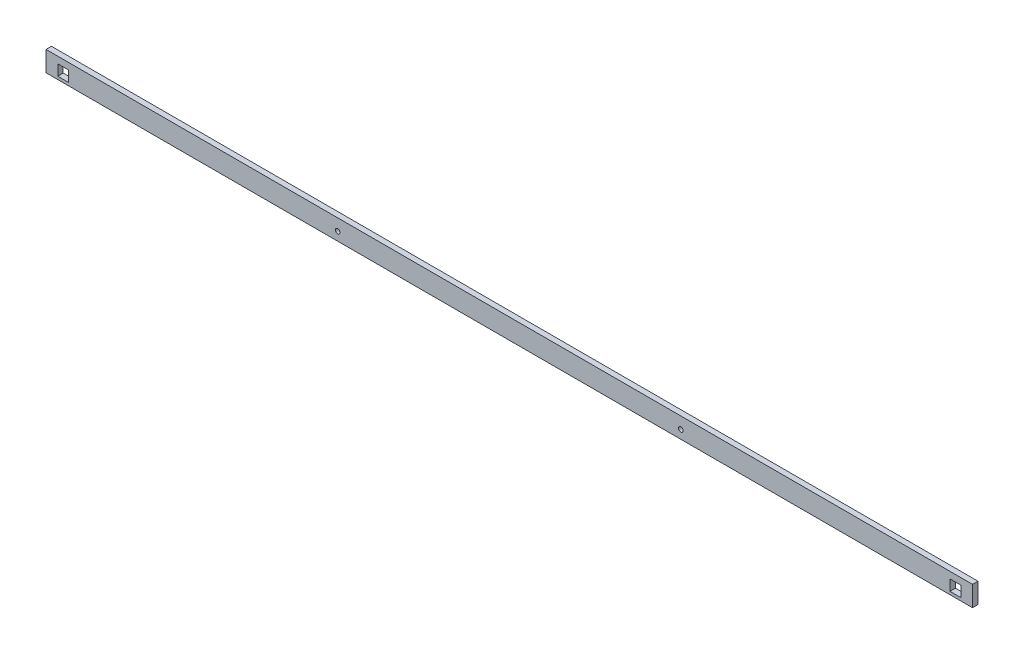
ISO-10303-21;
HEADER;
FILE_DESCRIPTION(('STEP AP214'),'2;1');
FILE_NAME('part.step','',(''),(''),'','','');
FILE_SCHEMA(('AUTOMOTIVE_DESIGN { 1 0 10303 214 1 1 1 1 }'));
ENDSEC;
DATA;
#1=APPLICATION_CONTEXT('core data for automotive mechanical design processes');
#2=APPLICATION_PROTOCOL_DEFINITION('international standard','automotive_design',2000,#1);
#3=PRODUCT_CONTEXT('',#1,'mechanical');
#4=PRODUCT('Part','Part','',(#3));
#5=PRODUCT_RELATED_PRODUCT_CATEGORY('part','',(#4));
#6=PRODUCT_DEFINITION_FORMATION('','',#4);
#7=PRODUCT_DEFINITION_CONTEXT('part definition',#1,'design');
#8=PRODUCT_DEFINITION('design','',#6,#7);
#9=PRODUCT_DEFINITION_SHAPE('','',#8);
#10=(LENGTH_UNIT() NAMED_UNIT(*) SI_UNIT(.MILLI.,.METRE.));
#11=(NAMED_UNIT(*) PLANE_ANGLE_UNIT() SI_UNIT($,.RADIAN.));
#12=(NAMED_UNIT(*) SI_UNIT($,.STERADIAN.) SOLID_ANGLE_UNIT());
#13=UNCERTAINTY_MEASURE_WITH_UNIT(LENGTH_MEASURE(1.E-05),#10,'distance_accuracy_value','');
#14=(GEOMETRIC_REPRESENTATION_CONTEXT(3) GLOBAL_UNCERTAINTY_ASSIGNED_CONTEXT((#13)) GLOBAL_UNIT_ASSIGNED_CONTEXT((#10,
#11,#12)) REPRESENTATION_CONTEXT('',''));
#15=CARTESIAN_POINT('',(0.,0.,0.));
#16=DIRECTION('',(0.,0.,1.));
#17=DIRECTION('',(1.,0.,0.));
#18=AXIS2_PLACEMENT_3D('',#15,#16,#17);
#19=CARTESIAN_POINT('',(0.,0.,3.18));
#20=DIRECTION('',(0.,0.,1.));
#21=DIRECTION('',(1.,0.,0.));
#22=AXIS2_PLACEMENT_3D('',#19,#20,#21);
#23=PLANE('',#22);
#24=CARTESIAN_POINT('',(-100.,-0.900000000000001,3.18));
#25=DIRECTION('',(0.,0.,-1.));
#26=DIRECTION('',(-1.,0.,0.));
#27=AXIS2_PLACEMENT_3D('',#24,#25,#26);
#28=CIRCLE('',#27,1.35000000000001);
#29=CARTESIAN_POINT('',(-98.65,-0.900000000000001,3.18));
#30=VERTEX_POINT('',#29);
#31=EDGE_CURVE('E345',#30,#30,#28,.T.);
#32=ORIENTED_EDGE('',*,*,#31,.T.);
#33=EDGE_LOOP('',(#32));
#34=FACE_BOUND('',#33,.T.);
#35=CARTESIAN_POINT('',(100.,-0.900000000000001,3.18));
#36=DIRECTION('',(0.,0.,1.));
#37=DIRECTION('',(1.,0.,0.));
#38=AXIS2_PLACEMENT_3D('',#35,#36,#37);
#39=CIRCLE('',#38,1.35000000000001);
#40=CARTESIAN_POINT('',(101.35,-0.900000000000001,3.18));
#41=VERTEX_POINT('',#40);
#42=EDGE_CURVE('E352',#41,#41,#39,.T.);
#43=ORIENTED_EDGE('',*,*,#42,.F.);
#44=EDGE_LOOP('',(#43));
#45=FACE_BOUND('',#44,.T.);
#46=DIRECTION('',(0.,1.,0.));
#47=VECTOR('',#46,1.);
#48=CARTESIAN_POINT('',(263.14,2.08999999999998,3.18));
#49=LINE('',#48,#47);
#50=CARTESIAN_POINT('',(263.14,-4.19000000000002,3.18));
#51=VERTEX_POINT('',#50);
#52=CARTESIAN_POINT('',(263.14,2.08999999999998,3.18));
#53=VERTEX_POINT('',#52);
#54=EDGE_CURVE('E183',#51,#53,#49,.T.);
#55=ORIENTED_EDGE('',*,*,#54,.F.);
#56=DIRECTION('',(1.,0.,0.));
#57=VECTOR('',#56,1.);
#58=CARTESIAN_POINT('',(256.86,-4.19000000000002,3.18));
#59=LINE('',#58,#57);
#60=CARTESIAN_POINT('',(256.86,-4.19000000000002,3.18));
#61=VERTEX_POINT('',#60);
#62=EDGE_CURVE('E194',#61,#51,#59,.T.);
#63=ORIENTED_EDGE('',*,*,#62,.F.);
#64=DIRECTION('',(0.,-1.,0.));
#65=VECTOR('',#64,1.);
#66=CARTESIAN_POINT('',(256.86,2.08999999999998,3.18));
#67=LINE('',#66,#65);
#68=CARTESIAN_POINT('',(256.86,2.08999999999998,3.18));
#69=VERTEX_POINT('',#68);
#70=EDGE_CURVE('E190',#69,#61,#67,.T.);
#71=ORIENTED_EDGE('',*,*,#70,.F.);
#72=DIRECTION('',(-1.,0.,0.));
#73=VECTOR('',#72,1.);
#74=CARTESIAN_POINT('',(256.86,2.08999999999998,3.18));
#75=LINE('',#74,#73);
#76=EDGE_CURVE('E186',#53,#69,#75,.T.);
#77=ORIENTED_EDGE('',*,*,#76,.F.);
#78=EDGE_LOOP('',(#55,#63,#71,#77));
#79=FACE_BOUND('',#78,.T.);
#80=DIRECTION('',(0.,1.,0.));
#81=VECTOR('',#80,1.);
#82=CARTESIAN_POINT('',(270.,5.9,3.18));
#83=LINE('',#82,#81);
#84=CARTESIAN_POINT('',(270.,-5.9,3.18));
#85=VERTEX_POINT('',#84);
#86=CARTESIAN_POINT('',(270.,5.9,3.18));
#87=VERTEX_POINT('',#86);
#88=EDGE_CURVE('E216',#85,#87,#83,.T.);
#89=ORIENTED_EDGE('',*,*,#88,.T.);
#90=DIRECTION('',(-1.,0.,0.));
#91=VECTOR('',#90,1.);
#92=CARTESIAN_POINT('',(-270.,5.9,3.18));
#93=LINE('',#92,#91);
#94=CARTESIAN_POINT('',(-270.,5.9,3.18));
#95=VERTEX_POINT('',#94);
#96=EDGE_CURVE('E220',#87,#95,#93,.T.);
#97=ORIENTED_EDGE('',*,*,#96,.T.);
#98=DIRECTION('',(0.,-1.,0.));
#99=VECTOR('',#98,1.);
#100=CARTESIAN_POINT('',(-270.,5.9,3.18));
#101=LINE('',#100,#99);
#102=CARTESIAN_POINT('',(-270.,-5.9,3.18));
#103=VERTEX_POINT('',#102);
#104=EDGE_CURVE('E224',#95,#103,#101,.T.);
#105=ORIENTED_EDGE('',*,*,#104,.T.);
#106=DIRECTION('',(1.,0.,0.));
#107=VECTOR('',#106,1.);
#108=CARTESIAN_POINT('',(-270.,-5.9,3.18));
#109=LINE('',#108,#107);
#110=EDGE_CURVE('E227',#103,#85,#109,.T.);
#111=ORIENTED_EDGE('',*,*,#110,.T.);
#112=EDGE_LOOP('',(#89,#97,#105,#111));
#113=FACE_BOUND('',#112,.T.);
#114=DIRECTION('',(-1.,0.,0.));
#115=VECTOR('',#114,1.);
#116=CARTESIAN_POINT('',(-256.86,-4.19000000000002,3.18));
#117=LINE('',#116,#115);
#118=CARTESIAN_POINT('',(-256.86,-4.19000000000002,3.18));
#119=VERTEX_POINT('',#118);
#120=CARTESIAN_POINT('',(-263.14,-4.19000000000002,3.18));
#121=VERTEX_POINT('',#120);
#122=EDGE_CURVE('E151',#119,#121,#117,.T.);
#123=ORIENTED_EDGE('',*,*,#122,.T.);
#124=DIRECTION('',(0.,1.,0.));
#125=VECTOR('',#124,1.);
#126=CARTESIAN_POINT('',(-263.14,2.08999999999998,3.18));
#127=LINE('',#126,#125);
#128=CARTESIAN_POINT('',(-263.14,2.08999999999998,3.18));
#129=VERTEX_POINT('',#128);
#130=EDGE_CURVE('E54',#121,#129,#127,.T.);
#131=ORIENTED_EDGE('',*,*,#130,.T.);
#132=DIRECTION('',(1.,0.,0.));
#133=VECTOR('',#132,1.);
#134=CARTESIAN_POINT('',(-256.86,2.08999999999998,3.18));
#135=LINE('',#134,#133);
#136=CARTESIAN_POINT('',(-256.86,2.08999999999998,3.18));
#137=VERTEX_POINT('',#136);
#138=EDGE_CURVE('E142',#129,#137,#135,.T.);
#139=ORIENTED_EDGE('',*,*,#138,.T.);
#140=DIRECTION('',(0.,-1.,0.));
#141=VECTOR('',#140,1.);
#142=CARTESIAN_POINT('',(-256.86,2.08999999999998,3.18));
#143=LINE('',#142,#141);
#144=EDGE_CURVE('E159',#137,#119,#143,.T.);
#145=ORIENTED_EDGE('',*,*,#144,.T.);
#146=EDGE_LOOP('',(#123,#131,#139,#145));
#147=FACE_BOUND('',#146,.T.);
#148=ADVANCED_FACE('F38',(#34,#45,#79,#113,#147),#23,.T.);
#149=CARTESIAN_POINT('',(0.,0.,0.));
#150=DIRECTION('',(0.,0.,1.));
#151=DIRECTION('',(1.,0.,0.));
#152=AXIS2_PLACEMENT_3D('',#149,#150,#151);
#153=PLANE('',#152);
#154=CARTESIAN_POINT('',(-100.,-0.900000000000001,0.));
#155=DIRECTION('',(0.,0.,1.));
#156=DIRECTION('',(1.,0.,0.));
#157=AXIS2_PLACEMENT_3D('',#154,#155,#156);
#158=CIRCLE('',#157,1.35000000000001);
#159=CARTESIAN_POINT('',(-98.65,-0.900000000000001,0.));
#160=VERTEX_POINT('',#159);
#161=EDGE_CURVE('E348',#160,#160,#158,.T.);
#162=ORIENTED_EDGE('',*,*,#161,.T.);
#163=EDGE_LOOP('',(#162));
#164=FACE_BOUND('',#163,.T.);
#165=CARTESIAN_POINT('',(100.,-0.900000000000001,0.));
#166=DIRECTION('',(0.,0.,1.));
#167=DIRECTION('',(1.,0.,0.));
#168=AXIS2_PLACEMENT_3D('',#165,#166,#167);
#169=CIRCLE('',#168,1.35000000000001);
#170=CARTESIAN_POINT('',(101.35,-0.900000000000001,0.));
#171=VERTEX_POINT('',#170);
#172=EDGE_CURVE('E358',#171,#171,#169,.F.);
#173=ORIENTED_EDGE('',*,*,#172,.F.);
#174=EDGE_LOOP('',(#173));
#175=FACE_BOUND('',#174,.T.);
#176=DIRECTION('',(0.,1.,0.));
#177=VECTOR('',#176,1.);
#178=CARTESIAN_POINT('',(270.,5.9,0.));
#179=LINE('',#178,#177);
#180=CARTESIAN_POINT('',(270.,-5.9,0.));
#181=VERTEX_POINT('',#180);
#182=CARTESIAN_POINT('',(270.,5.9,0.));
#183=VERTEX_POINT('',#182);
#184=EDGE_CURVE('E215',#181,#183,#179,.T.);
#185=ORIENTED_EDGE('',*,*,#184,.F.);
#186=DIRECTION('',(1.,0.,0.));
#187=VECTOR('',#186,1.);
#188=CARTESIAN_POINT('',(-270.,-5.9,0.));
#189=LINE('',#188,#187);
#190=CARTESIAN_POINT('',(-270.,-5.9,0.));
#191=VERTEX_POINT('',#190);
#192=EDGE_CURVE('E221',#191,#181,#189,.T.);
#193=ORIENTED_EDGE('',*,*,#192,.F.);
#194=DIRECTION('',(0.,-1.,0.));
#195=VECTOR('',#194,1.);
#196=CARTESIAN_POINT('',(-270.,5.9,0.));
#197=LINE('',#196,#195);
#198=CARTESIAN_POINT('',(-270.,5.9,0.));
#199=VERTEX_POINT('',#198);
#200=EDGE_CURVE('E237',#199,#191,#197,.T.);
#201=ORIENTED_EDGE('',*,*,#200,.F.);
#202=DIRECTION('',(-1.,0.,0.));
#203=VECTOR('',#202,1.);
#204=CARTESIAN_POINT('',(-270.,5.9,0.));
#205=LINE('',#204,#203);
#206=EDGE_CURVE('E234',#183,#199,#205,.T.);
#207=ORIENTED_EDGE('',*,*,#206,.F.);
#208=EDGE_LOOP('',(#185,#193,#201,#207));
#209=FACE_BOUND('',#208,.T.);
#210=DIRECTION('',(-1.,0.,0.));
#211=VECTOR('',#210,1.);
#212=CARTESIAN_POINT('',(256.86,-4.19000000000002,0.));
#213=LINE('',#212,#211);
#214=CARTESIAN_POINT('',(263.14,-4.19000000000002,0.));
#215=VERTEX_POINT('',#214);
#216=CARTESIAN_POINT('',(256.86,-4.19000000000002,0.));
#217=VERTEX_POINT('',#216);
#218=EDGE_CURVE('E175',#215,#217,#213,.T.);
#219=ORIENTED_EDGE('',*,*,#218,.F.);
#220=DIRECTION('',(0.,-1.,0.));
#221=VECTOR('',#220,1.);
#222=CARTESIAN_POINT('',(263.14,2.08999999999998,0.));
#223=LINE('',#222,#221);
#224=CARTESIAN_POINT('',(263.14,2.08999999999998,0.));
#225=VERTEX_POINT('',#224);
#226=EDGE_CURVE('E179',#225,#215,#223,.T.);
#227=ORIENTED_EDGE('',*,*,#226,.F.);
#228=DIRECTION('',(1.,0.,0.));
#229=VECTOR('',#228,1.);
#230=CARTESIAN_POINT('',(256.86,2.08999999999998,0.));
#231=LINE('',#230,#229);
#232=CARTESIAN_POINT('',(256.86,2.08999999999998,0.));
#233=VERTEX_POINT('',#232);
#234=EDGE_CURVE('E202',#233,#225,#231,.T.);
#235=ORIENTED_EDGE('',*,*,#234,.F.);
#236=DIRECTION('',(0.,1.,0.));
#237=VECTOR('',#236,1.);
#238=CARTESIAN_POINT('',(256.86,2.08999999999998,0.));
#239=LINE('',#238,#237);
#240=EDGE_CURVE('E135',#217,#233,#239,.T.);
#241=ORIENTED_EDGE('',*,*,#240,.F.);
#242=EDGE_LOOP('',(#219,#227,#235,#241));
#243=FACE_BOUND('',#242,.T.);
#244=DIRECTION('',(0.,-1.,0.));
#245=VECTOR('',#244,1.);
#246=CARTESIAN_POINT('',(-263.14,2.08999999999998,0.));
#247=LINE('',#246,#245);
#248=CARTESIAN_POINT('',(-263.14,2.08999999999998,0.));
#249=VERTEX_POINT('',#248);
#250=CARTESIAN_POINT('',(-263.14,-4.19000000000002,0.));
#251=VERTEX_POINT('',#250);
#252=EDGE_CURVE('E139',#249,#251,#247,.T.);
#253=ORIENTED_EDGE('',*,*,#252,.T.);
#254=DIRECTION('',(1.,0.,0.));
#255=VECTOR('',#254,1.);
#256=CARTESIAN_POINT('',(-256.86,-4.19000000000002,0.));
#257=LINE('',#256,#255);
#258=CARTESIAN_POINT('',(-256.86,-4.19000000000002,0.));
#259=VERTEX_POINT('',#258);
#260=EDGE_CURVE('E127',#251,#259,#257,.T.);
#261=ORIENTED_EDGE('',*,*,#260,.T.);
#262=DIRECTION('',(0.,1.,0.));
#263=VECTOR('',#262,1.);
#264=CARTESIAN_POINT('',(-256.86,2.08999999999998,0.));
#265=LINE('',#264,#263);
#266=CARTESIAN_POINT('',(-256.86,2.08999999999998,0.));
#267=VERTEX_POINT('',#266);
#268=EDGE_CURVE('E153',#259,#267,#265,.T.);
#269=ORIENTED_EDGE('',*,*,#268,.T.);
#270=DIRECTION('',(-1.,0.,0.));
#271=VECTOR('',#270,1.);
#272=CARTESIAN_POINT('',(-256.86,2.08999999999998,0.));
#273=LINE('',#272,#271);
#274=EDGE_CURVE('E146',#267,#249,#273,.T.);
#275=ORIENTED_EDGE('',*,*,#274,.T.);
#276=EDGE_LOOP('',(#253,#261,#269,#275));
#277=FACE_BOUND('',#276,.T.);
#278=ADVANCED_FACE('F145',(#164,#175,#209,#243,#277),#153,.F.);
#279=CARTESIAN_POINT('',(270.,5.9,3.18));
#280=DIRECTION('',(-1.,0.,0.));
#281=DIRECTION('',(0.,0.,1.));
#282=AXIS2_PLACEMENT_3D('',#279,#280,#281);
#283=PLANE('',#282);
#284=ORIENTED_EDGE('',*,*,#184,.T.);
#285=DIRECTION('',(0.,0.,-1.));
#286=VECTOR('',#285,1.);
#287=CARTESIAN_POINT('',(270.,5.9,3.18));
#288=LINE('',#287,#286);
#289=EDGE_CURVE('E11',#87,#183,#288,.T.);
#290=ORIENTED_EDGE('',*,*,#289,.F.);
#291=ORIENTED_EDGE('',*,*,#88,.F.);
#292=DIRECTION('',(0.,0.,-1.));
#293=VECTOR('',#292,1.);
#294=CARTESIAN_POINT('',(270.,-5.9,3.18));
#295=LINE('',#294,#293);
#296=EDGE_CURVE('E230',#85,#181,#295,.T.);
#297=ORIENTED_EDGE('',*,*,#296,.T.);
#298=EDGE_LOOP('',(#284,#290,#291,#297));
#299=FACE_BOUND('',#298,.T.);
#300=ADVANCED_FACE('F40',(#299),#283,.F.);
#301=CARTESIAN_POINT('',(-270.,5.9,3.18));
#302=DIRECTION('',(0.,-1.,0.));
#303=DIRECTION('',(0.,0.,-1.));
#304=AXIS2_PLACEMENT_3D('',#301,#302,#303);
#305=PLANE('',#304);
#306=ORIENTED_EDGE('',*,*,#206,.T.);
#307=DIRECTION('',(0.,0.,-1.));
#308=VECTOR('',#307,1.);
#309=CARTESIAN_POINT('',(-270.,5.9,3.18));
#310=LINE('',#309,#308);
#311=EDGE_CURVE('E47',#95,#199,#310,.T.);
#312=ORIENTED_EDGE('',*,*,#311,.F.);
#313=ORIENTED_EDGE('',*,*,#96,.F.);
#314=ORIENTED_EDGE('',*,*,#289,.T.);
#315=EDGE_LOOP('',(#306,#312,#313,#314));
#316=FACE_BOUND('',#315,.T.);
#317=ADVANCED_FACE('F270',(#316),#305,.F.);
#318=CARTESIAN_POINT('',(-270.,5.9,3.18));
#319=DIRECTION('',(1.,0.,0.));
#320=DIRECTION('',(0.,0.,-1.));
#321=AXIS2_PLACEMENT_3D('',#318,#319,#320);
#322=PLANE('',#321);
#323=ORIENTED_EDGE('',*,*,#200,.T.);
#324=DIRECTION('',(0.,0.,-1.));
#325=VECTOR('',#324,1.);
#326=CARTESIAN_POINT('',(-270.,-5.9,3.18));
#327=LINE('',#326,#325);
#328=EDGE_CURVE('E245',#103,#191,#327,.T.);
#329=ORIENTED_EDGE('',*,*,#328,.F.);
#330=ORIENTED_EDGE('',*,*,#104,.F.);
#331=ORIENTED_EDGE('',*,*,#311,.T.);
#332=EDGE_LOOP('',(#323,#329,#330,#331));
#333=FACE_BOUND('',#332,.T.);
#334=ADVANCED_FACE('F254',(#333),#322,.F.);
#335=CARTESIAN_POINT('',(-270.,-5.9,3.18));
#336=DIRECTION('',(0.,1.,0.));
#337=DIRECTION('',(0.,0.,1.));
#338=AXIS2_PLACEMENT_3D('',#335,#336,#337);
#339=PLANE('',#338);
#340=ORIENTED_EDGE('',*,*,#192,.T.);
#341=ORIENTED_EDGE('',*,*,#296,.F.);
#342=ORIENTED_EDGE('',*,*,#110,.F.);
#343=ORIENTED_EDGE('',*,*,#328,.T.);
#344=EDGE_LOOP('',(#340,#341,#342,#343));
#345=FACE_BOUND('',#344,.T.);
#346=ADVANCED_FACE('F263',(#345),#339,.F.);
#347=CARTESIAN_POINT('',(263.14,2.08999999999998,-0.00100000000000013));
#348=DIRECTION('',(1.,0.,0.));
#349=DIRECTION('',(0.,0.,-1.));
#350=AXIS2_PLACEMENT_3D('',#347,#348,#349);
#351=PLANE('',#350);
#352=ORIENTED_EDGE('',*,*,#226,.T.);
#353=DIRECTION('',(0.,0.,1.));
#354=VECTOR('',#353,1.);
#355=CARTESIAN_POINT('',(263.14,-4.19000000000002,-0.00100000000000013));
#356=LINE('',#355,#354);
#357=EDGE_CURVE('E199',#215,#51,#356,.T.);
#358=ORIENTED_EDGE('',*,*,#357,.T.);
#359=ORIENTED_EDGE('',*,*,#54,.T.);
#360=DIRECTION('',(0.,0.,1.));
#361=VECTOR('',#360,1.);
#362=CARTESIAN_POINT('',(263.14,2.08999999999998,-0.00100000000000013));
#363=LINE('',#362,#361);
#364=EDGE_CURVE('E198',#225,#53,#363,.T.);
#365=ORIENTED_EDGE('',*,*,#364,.F.);
#366=EDGE_LOOP('',(#352,#358,#359,#365));
#367=FACE_BOUND('',#366,.T.);
#368=ADVANCED_FACE('F288',(#367),#351,.F.);
#369=CARTESIAN_POINT('',(256.86,-4.19000000000002,-0.00100000000000013));
#370=DIRECTION('',(0.,-1.,0.));
#371=DIRECTION('',(0.,0.,-1.));
#372=AXIS2_PLACEMENT_3D('',#369,#370,#371);
#373=PLANE('',#372);
#374=ORIENTED_EDGE('',*,*,#218,.T.);
#375=DIRECTION('',(0.,0.,1.));
#376=VECTOR('',#375,1.);
#377=CARTESIAN_POINT('',(256.86,-4.19000000000002,-0.00100000000000013));
#378=LINE('',#377,#376);
#379=EDGE_CURVE('E203',#217,#61,#378,.T.);
#380=ORIENTED_EDGE('',*,*,#379,.T.);
#381=ORIENTED_EDGE('',*,*,#62,.T.);
#382=ORIENTED_EDGE('',*,*,#357,.F.);
#383=EDGE_LOOP('',(#374,#380,#381,#382));
#384=FACE_BOUND('',#383,.T.);
#385=ADVANCED_FACE('F295',(#384),#373,.F.);
#386=CARTESIAN_POINT('',(256.86,2.08999999999998,-0.00100000000000013));
#387=DIRECTION('',(-1.,0.,0.));
#388=DIRECTION('',(0.,0.,1.));
#389=AXIS2_PLACEMENT_3D('',#386,#387,#388);
#390=PLANE('',#389);
#391=ORIENTED_EDGE('',*,*,#240,.T.);
#392=DIRECTION('',(0.,0.,1.));
#393=VECTOR('',#392,1.);
#394=CARTESIAN_POINT('',(256.86,2.08999999999998,-0.00100000000000013));
#395=LINE('',#394,#393);
#396=EDGE_CURVE('E206',#233,#69,#395,.T.);
#397=ORIENTED_EDGE('',*,*,#396,.T.);
#398=ORIENTED_EDGE('',*,*,#70,.T.);
#399=ORIENTED_EDGE('',*,*,#379,.F.);
#400=EDGE_LOOP('',(#391,#397,#398,#399));
#401=FACE_BOUND('',#400,.T.);
#402=ADVANCED_FACE('F300',(#401),#390,.F.);
#403=CARTESIAN_POINT('',(256.86,2.08999999999998,-0.00100000000000013));
#404=DIRECTION('',(0.,1.,0.));
#405=DIRECTION('',(0.,0.,1.));
#406=AXIS2_PLACEMENT_3D('',#403,#404,#405);
#407=PLANE('',#406);
#408=ORIENTED_EDGE('',*,*,#234,.T.);
#409=ORIENTED_EDGE('',*,*,#364,.T.);
#410=ORIENTED_EDGE('',*,*,#76,.T.);
#411=ORIENTED_EDGE('',*,*,#396,.F.);
#412=EDGE_LOOP('',(#408,#409,#410,#411));
#413=FACE_BOUND('',#412,.T.);
#414=ADVANCED_FACE('F313',(#413),#407,.F.);
#415=CARTESIAN_POINT('',(-263.14,2.08999999999998,-0.00100000000000013));
#416=DIRECTION('',(1.,0.,0.));
#417=DIRECTION('',(0.,0.,-1.));
#418=AXIS2_PLACEMENT_3D('',#415,#416,#417);
#419=PLANE('',#418);
#420=DIRECTION('',(0.,0.,1.));
#421=VECTOR('',#420,1.);
#422=CARTESIAN_POINT('',(-263.14,2.08999999999998,-0.00100000000000013));
#423=LINE('',#422,#421);
#424=EDGE_CURVE('E136',#249,#129,#423,.T.);
#425=ORIENTED_EDGE('',*,*,#424,.T.);
#426=ORIENTED_EDGE('',*,*,#130,.F.);
#427=DIRECTION('',(0.,0.,1.));
#428=VECTOR('',#427,1.);
#429=CARTESIAN_POINT('',(-263.14,-4.19000000000002,-0.00100000000000013));
#430=LINE('',#429,#428);
#431=EDGE_CURVE('E129',#251,#121,#430,.T.);
#432=ORIENTED_EDGE('',*,*,#431,.F.);
#433=ORIENTED_EDGE('',*,*,#252,.F.);
#434=EDGE_LOOP('',(#425,#426,#432,#433));
#435=FACE_BOUND('',#434,.T.);
#436=ADVANCED_FACE('F138',(#435),#419,.T.);
#437=CARTESIAN_POINT('',(-256.86,2.08999999999998,-0.00100000000000013));
#438=DIRECTION('',(0.,-1.,0.));
#439=DIRECTION('',(0.,0.,-1.));
#440=AXIS2_PLACEMENT_3D('',#437,#438,#439);
#441=PLANE('',#440);
#442=DIRECTION('',(0.,0.,1.));
#443=VECTOR('',#442,1.);
#444=CARTESIAN_POINT('',(-256.86,2.08999999999998,-0.00100000000000013));
#445=LINE('',#444,#443);
#446=EDGE_CURVE('E168',#267,#137,#445,.T.);
#447=ORIENTED_EDGE('',*,*,#446,.T.);
#448=ORIENTED_EDGE('',*,*,#138,.F.);
#449=ORIENTED_EDGE('',*,*,#424,.F.);
#450=ORIENTED_EDGE('',*,*,#274,.F.);
#451=EDGE_LOOP('',(#447,#448,#449,#450));
#452=FACE_BOUND('',#451,.T.);
#453=ADVANCED_FACE('F324',(#452),#441,.T.);
#454=CARTESIAN_POINT('',(-256.86,2.08999999999998,-0.00100000000000013));
#455=DIRECTION('',(-1.,0.,0.));
#456=DIRECTION('',(0.,0.,1.));
#457=AXIS2_PLACEMENT_3D('',#454,#455,#456);
#458=PLANE('',#457);
#459=DIRECTION('',(0.,0.,1.));
#460=VECTOR('',#459,1.);
#461=CARTESIAN_POINT('',(-256.86,-4.19000000000002,-0.00100000000000013));
#462=LINE('',#461,#460);
#463=EDGE_CURVE('E62',#259,#119,#462,.T.);
#464=ORIENTED_EDGE('',*,*,#463,.T.);
#465=ORIENTED_EDGE('',*,*,#144,.F.);
#466=ORIENTED_EDGE('',*,*,#446,.F.);
#467=ORIENTED_EDGE('',*,*,#268,.F.);
#468=EDGE_LOOP('',(#464,#465,#466,#467));
#469=FACE_BOUND('',#468,.T.);
#470=ADVANCED_FACE('F328',(#469),#458,.T.);
#471=CARTESIAN_POINT('',(-256.86,-4.19000000000002,-0.00100000000000013));
#472=DIRECTION('',(0.,1.,0.));
#473=DIRECTION('',(0.,0.,1.));
#474=AXIS2_PLACEMENT_3D('',#471,#472,#473);
#475=PLANE('',#474);
#476=ORIENTED_EDGE('',*,*,#431,.T.);
#477=ORIENTED_EDGE('',*,*,#122,.F.);
#478=ORIENTED_EDGE('',*,*,#463,.F.);
#479=ORIENTED_EDGE('',*,*,#260,.F.);
#480=EDGE_LOOP('',(#476,#477,#478,#479));
#481=FACE_BOUND('',#480,.T.);
#482=ADVANCED_FACE('F128',(#481),#475,.T.);
#483=CARTESIAN_POINT('',(100.,-0.900000000000001,-0.00100000000000013));
#484=DIRECTION('',(0.,0.,1.));
#485=DIRECTION('',(1.,0.,0.));
#486=AXIS2_PLACEMENT_3D('',#483,#484,#485);
#487=CYLINDRICAL_SURFACE('',#486,1.35000000000001);
#488=CARTESIAN_POINT('',(101.35,-0.900000000000001,3.18));
#489=CARTESIAN_POINT('',(101.35,-0.900000000000001,3.146875));
#490=CARTESIAN_POINT('',(101.35,-0.900000000000001,3.11375));
#491=CARTESIAN_POINT('',(101.35,-0.900000000000001,3.0475));
#492=CARTESIAN_POINT('',(101.35,-0.900000000000001,3.014375));
#493=CARTESIAN_POINT('',(101.35,-0.900000000000001,2.948125));
#494=CARTESIAN_POINT('',(101.35,-0.900000000000001,2.915));
#495=CARTESIAN_POINT('',(101.35,-0.900000000000001,2.84875));
#496=CARTESIAN_POINT('',(101.35,-0.900000000000001,2.815625));
#497=CARTESIAN_POINT('',(101.35,-0.900000000000001,2.749375));
#498=CARTESIAN_POINT('',(101.35,-0.900000000000001,2.71625));
#499=CARTESIAN_POINT('',(101.35,-0.900000000000001,2.65));
#500=CARTESIAN_POINT('',(101.35,-0.900000000000001,2.616875));
#501=CARTESIAN_POINT('',(101.35,-0.900000000000001,2.550625));
#502=CARTESIAN_POINT('',(101.35,-0.900000000000001,2.5175));
#503=CARTESIAN_POINT('',(101.35,-0.900000000000001,2.45125));
#504=CARTESIAN_POINT('',(101.35,-0.900000000000001,2.418125));
#505=CARTESIAN_POINT('',(101.35,-0.900000000000001,2.351875));
#506=CARTESIAN_POINT('',(101.35,-0.900000000000001,2.31875));
#507=CARTESIAN_POINT('',(101.35,-0.900000000000001,2.2525));
#508=CARTESIAN_POINT('',(101.35,-0.900000000000001,2.219375));
#509=CARTESIAN_POINT('',(101.35,-0.900000000000001,2.153125));
#510=CARTESIAN_POINT('',(101.35,-0.900000000000001,2.12));
#511=CARTESIAN_POINT('',(101.35,-0.900000000000001,2.05375));
#512=CARTESIAN_POINT('',(101.35,-0.900000000000001,2.020625));
#513=CARTESIAN_POINT('',(101.35,-0.900000000000001,1.954375));
#514=CARTESIAN_POINT('',(101.35,-0.900000000000001,1.92125));
#515=CARTESIAN_POINT('',(101.35,-0.900000000000001,1.855));
#516=CARTESIAN_POINT('',(101.35,-0.900000000000001,1.821875));
#517=CARTESIAN_POINT('',(101.35,-0.900000000000001,1.755625));
#518=CARTESIAN_POINT('',(101.35,-0.900000000000001,1.7225));
#519=CARTESIAN_POINT('',(101.35,-0.900000000000001,1.65625));
#520=CARTESIAN_POINT('',(101.35,-0.900000000000001,1.623125));
#521=CARTESIAN_POINT('',(101.35,-0.900000000000001,1.556875));
#522=CARTESIAN_POINT('',(101.35,-0.900000000000001,1.52375));
#523=CARTESIAN_POINT('',(101.35,-0.900000000000001,1.4575));
#524=CARTESIAN_POINT('',(101.35,-0.900000000000001,1.424375));
#525=CARTESIAN_POINT('',(101.35,-0.900000000000001,1.358125));
#526=CARTESIAN_POINT('',(101.35,-0.900000000000001,1.325));
#527=CARTESIAN_POINT('',(101.35,-0.900000000000001,1.25875));
#528=CARTESIAN_POINT('',(101.35,-0.900000000000001,1.225625));
#529=CARTESIAN_POINT('',(101.35,-0.900000000000001,1.159375));
#530=CARTESIAN_POINT('',(101.35,-0.900000000000001,1.12625));
#531=CARTESIAN_POINT('',(101.35,-0.900000000000001,1.06));
#532=CARTESIAN_POINT('',(101.35,-0.900000000000001,1.026875));
#533=CARTESIAN_POINT('',(101.35,-0.900000000000001,0.960625));
#534=CARTESIAN_POINT('',(101.35,-0.900000000000001,0.9275));
#535=CARTESIAN_POINT('',(101.35,-0.900000000000001,0.86125));
#536=CARTESIAN_POINT('',(101.35,-0.900000000000001,0.828125));
#537=CARTESIAN_POINT('',(101.35,-0.900000000000001,0.761875));
#538=CARTESIAN_POINT('',(101.35,-0.900000000000001,0.72875));
#539=CARTESIAN_POINT('',(101.35,-0.900000000000001,0.6625));
#540=CARTESIAN_POINT('',(101.35,-0.900000000000001,0.629375));
#541=CARTESIAN_POINT('',(101.35,-0.900000000000001,0.563125));
#542=CARTESIAN_POINT('',(101.35,-0.900000000000001,0.53));
#543=CARTESIAN_POINT('',(101.35,-0.900000000000001,0.46375));
#544=CARTESIAN_POINT('',(101.35,-0.900000000000001,0.430625));
#545=CARTESIAN_POINT('',(101.35,-0.900000000000001,0.364375));
#546=CARTESIAN_POINT('',(101.35,-0.900000000000001,0.33125));
#547=CARTESIAN_POINT('',(101.35,-0.900000000000001,0.265));
#548=CARTESIAN_POINT('',(101.35,-0.900000000000001,0.231875));
#549=CARTESIAN_POINT('',(101.35,-0.900000000000001,0.165625));
#550=CARTESIAN_POINT('',(101.35,-0.900000000000001,0.1325));
#551=CARTESIAN_POINT('',(101.35,-0.900000000000001,0.06625));
#552=CARTESIAN_POINT('',(101.35,-0.900000000000001,0.033125));
#553=CARTESIAN_POINT('',(101.35,-0.900000000000001,0.));
#554=B_SPLINE_CURVE_WITH_KNOTS('',3,(#488,#489,#490,#491,#492,#493,#494,#495,#496,#497,#498,
#499,#500,#501,#502,#503,#504,#505,#506,#507,#508,#509,#510,#511,#512,#513,#514,#515,#516,#517,
#518,#519,#520,#521,#522,#523,#524,#525,#526,#527,#528,#529,#530,#531,#532,#533,#534,#535,#536,
#537,#538,#539,#540,#541,#542,#543,#544,#545,#546,#547,#548,#549,#550,#551,#552,#553),
.UNSPECIFIED.,.F.,.F.,(4,2,2,2,2,2,2,2,2,2,2,2,2,2,2,2,2,2,2,2,2,2,2,2,2,2,2,2,2,2,2,2,4),(0.,
0.0993750000000001,0.19875,0.298125,0.3975,0.496875,0.59625,0.695625,0.795,0.894375,0.99375,
1.093125,1.1925,1.291875,1.39125,1.490625,1.59,1.689375,1.78875,1.888125,1.9875,2.086875,
2.18625,2.285625,2.385,2.484375,2.58375,2.683125,2.7825,2.881875,2.98125,3.080625,3.18),.UNSPECIFIED.);
#555=EDGE_CURVE('BSEAM327',#41,#171,#554,.T.);
#556=ORIENTED_EDGE('',*,*,#42,.T.);
#557=ORIENTED_EDGE('',*,*,#172,.T.);
#558=ORIENTED_EDGE('',*,*,#555,.T.);
#559=ORIENTED_EDGE('',*,*,#555,.F.);
#560=EDGE_LOOP('',(#556,#558,#557,#559));
#561=FACE_BOUND('',#560,.T.);
#562=ADVANCED_FACE('F327',(#561),#487,.F.);
#563=CARTESIAN_POINT('',(-100.,-0.900000000000001,-0.00100000000000013));
#564=DIRECTION('',(0.,0.,1.));
#565=DIRECTION('',(1.,0.,0.));
#566=AXIS2_PLACEMENT_3D('',#563,#564,#565);
#567=CYLINDRICAL_SURFACE('',#566,1.35000000000001);
#568=CARTESIAN_POINT('',(-98.65,-0.900000000000001,3.18));
#569=CARTESIAN_POINT('',(-98.65,-0.900000000000001,3.146875));
#570=CARTESIAN_POINT('',(-98.65,-0.900000000000001,3.11375));
#571=CARTESIAN_POINT('',(-98.65,-0.900000000000001,3.0475));
#572=CARTESIAN_POINT('',(-98.65,-0.900000000000001,3.014375));
#573=CARTESIAN_POINT('',(-98.65,-0.900000000000001,2.948125));
#574=CARTESIAN_POINT('',(-98.65,-0.900000000000001,2.915));
#575=CARTESIAN_POINT('',(-98.65,-0.900000000000001,2.84875));
#576=CARTESIAN_POINT('',(-98.65,-0.900000000000001,2.815625));
#577=CARTESIAN_POINT('',(-98.65,-0.900000000000001,2.749375));
#578=CARTESIAN_POINT('',(-98.65,-0.900000000000001,2.71625));
#579=CARTESIAN_POINT('',(-98.65,-0.900000000000001,2.65));
#580=CARTESIAN_POINT('',(-98.65,-0.900000000000001,2.616875));
#581=CARTESIAN_POINT('',(-98.65,-0.900000000000001,2.550625));
#582=CARTESIAN_POINT('',(-98.65,-0.900000000000001,2.5175));
#583=CARTESIAN_POINT('',(-98.65,-0.900000000000001,2.45125));
#584=CARTESIAN_POINT('',(-98.65,-0.900000000000001,2.418125));
#585=CARTESIAN_POINT('',(-98.65,-0.900000000000001,2.351875));
#586=CARTESIAN_POINT('',(-98.65,-0.900000000000001,2.31875));
#587=CARTESIAN_POINT('',(-98.65,-0.900000000000001,2.2525));
#588=CARTESIAN_POINT('',(-98.65,-0.900000000000001,2.219375));
#589=CARTESIAN_POINT('',(-98.65,-0.900000000000001,2.153125));
#590=CARTESIAN_POINT('',(-98.65,-0.900000000000001,2.12));
#591=CARTESIAN_POINT('',(-98.65,-0.900000000000001,2.05375));
#592=CARTESIAN_POINT('',(-98.65,-0.900000000000001,2.020625));
#593=CARTESIAN_POINT('',(-98.65,-0.900000000000001,1.954375));
#594=CARTESIAN_POINT('',(-98.65,-0.900000000000001,1.92125));
#595=CARTESIAN_POINT('',(-98.65,-0.900000000000001,1.855));
#596=CARTESIAN_POINT('',(-98.65,-0.900000000000001,1.821875));
#597=CARTESIAN_POINT('',(-98.65,-0.900000000000001,1.755625));
#598=CARTESIAN_POINT('',(-98.65,-0.900000000000001,1.7225));
#599=CARTESIAN_POINT('',(-98.65,-0.900000000000001,1.65625));
#600=CARTESIAN_POINT('',(-98.65,-0.900000000000001,1.623125));
#601=CARTESIAN_POINT('',(-98.65,-0.900000000000001,1.556875));
#602=CARTESIAN_POINT('',(-98.65,-0.900000000000001,1.52375));
#603=CARTESIAN_POINT('',(-98.65,-0.900000000000001,1.4575));
#604=CARTESIAN_POINT('',(-98.65,-0.900000000000001,1.424375));
#605=CARTESIAN_POINT('',(-98.65,-0.900000000000001,1.358125));
#606=CARTESIAN_POINT('',(-98.65,-0.900000000000001,1.325));
#607=CARTESIAN_POINT('',(-98.65,-0.900000000000001,1.25875));
#608=CARTESIAN_POINT('',(-98.65,-0.900000000000001,1.225625));
#609=CARTESIAN_POINT('',(-98.65,-0.900000000000001,1.159375));
#610=CARTESIAN_POINT('',(-98.65,-0.900000000000001,1.12625));
#611=CARTESIAN_POINT('',(-98.65,-0.900000000000001,1.06));
#612=CARTESIAN_POINT('',(-98.65,-0.900000000000001,1.026875));
#613=CARTESIAN_POINT('',(-98.65,-0.900000000000001,0.960625));
#614=CARTESIAN_POINT('',(-98.65,-0.900000000000001,0.9275));
#615=CARTESIAN_POINT('',(-98.65,-0.900000000000001,0.86125));
#616=CARTESIAN_POINT('',(-98.65,-0.900000000000001,0.828125));
#617=CARTESIAN_POINT('',(-98.65,-0.900000000000001,0.761875));
#618=CARTESIAN_POINT('',(-98.65,-0.900000000000001,0.72875));
#619=CARTESIAN_POINT('',(-98.65,-0.900000000000001,0.6625));
#620=CARTESIAN_POINT('',(-98.65,-0.900000000000001,0.629375));
#621=CARTESIAN_POINT('',(-98.65,-0.900000000000001,0.563125));
#622=CARTESIAN_POINT('',(-98.65,-0.900000000000001,0.53));
#623=CARTESIAN_POINT('',(-98.65,-0.900000000000001,0.46375));
#624=CARTESIAN_POINT('',(-98.65,-0.900000000000001,0.430625));
#625=CARTESIAN_POINT('',(-98.65,-0.900000000000001,0.364375));
#626=CARTESIAN_POINT('',(-98.65,-0.900000000000001,0.33125));
#627=CARTESIAN_POINT('',(-98.65,-0.900000000000001,0.265));
#628=CARTESIAN_POINT('',(-98.65,-0.900000000000001,0.231875));
#629=CARTESIAN_POINT('',(-98.65,-0.900000000000001,0.165625));
#630=CARTESIAN_POINT('',(-98.65,-0.900000000000001,0.1325));
#631=CARTESIAN_POINT('',(-98.65,-0.900000000000001,0.06625));
#632=CARTESIAN_POINT('',(-98.65,-0.900000000000001,0.033125));
#633=CARTESIAN_POINT('',(-98.65,-0.900000000000001,0.));
#634=B_SPLINE_CURVE_WITH_KNOTS('',3,(#568,#569,#570,#571,#572,#573,#574,#575,#576,#577,#578,
#579,#580,#581,#582,#583,#584,#585,#586,#587,#588,#589,#590,#591,#592,#593,#594,#595,#596,#597,
#598,#599,#600,#601,#602,#603,#604,#605,#606,#607,#608,#609,#610,#611,#612,#613,#614,#615,#616,
#617,#618,#619,#620,#621,#622,#623,#624,#625,#626,#627,#628,#629,#630,#631,#632,#633),
.UNSPECIFIED.,.F.,.F.,(4,2,2,2,2,2,2,2,2,2,2,2,2,2,2,2,2,2,2,2,2,2,2,2,2,2,2,2,2,2,2,2,4),(0.,
0.0993750000000001,0.19875,0.298125,0.3975,0.496875,0.59625,0.695625,0.795,0.894375,0.99375,
1.093125,1.1925,1.291875,1.39125,1.490625,1.59,1.689375,1.78875,1.888125,1.9875,2.086875,
2.18625,2.285625,2.385,2.484375,2.58375,2.683125,2.7825,2.881875,2.98125,3.080625,3.18),.UNSPECIFIED.);
#635=EDGE_CURVE('BSEAM337',#30,#160,#634,.T.);
#636=ORIENTED_EDGE('',*,*,#31,.F.);
#637=ORIENTED_EDGE('',*,*,#161,.F.);
#638=ORIENTED_EDGE('',*,*,#635,.T.);
#639=ORIENTED_EDGE('',*,*,#635,.F.);
#640=EDGE_LOOP('',(#636,#638,#637,#639));
#641=FACE_BOUND('',#640,.T.);
#642=ADVANCED_FACE('F337',(#641),#567,.F.);
#643=CLOSED_SHELL('',(#148,#278,#300,#317,#334,#346,#368,#385,#402,#414,#436,#453,#470,#482,
#562,#642));
#644=MANIFOLD_SOLID_BREP('B2',#643);
#645=ADVANCED_BREP_SHAPE_REPRESENTATION('',(#18,#644),#14);
#646=SHAPE_DEFINITION_REPRESENTATION(#9,#645);
ENDSEC;
END-ISO-10303-21;
